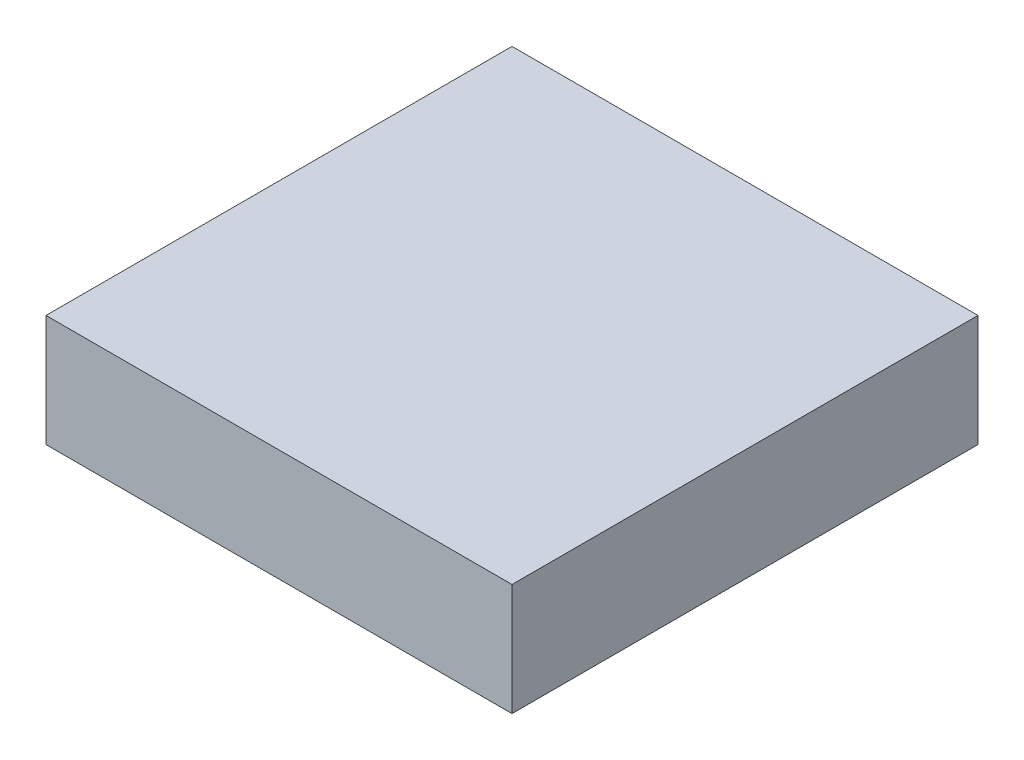
ISO-10303-21;
HEADER;
FILE_DESCRIPTION(('STEP AP214'),'2;1');
FILE_NAME('part.step','',(''),(''),'','','');
FILE_SCHEMA(('AUTOMOTIVE_DESIGN { 1 0 10303 214 1 1 1 1 }'));
ENDSEC;
DATA;
#1=APPLICATION_CONTEXT('core data for automotive mechanical design processes');
#2=APPLICATION_PROTOCOL_DEFINITION('international standard','automotive_design',2000,#1);
#3=PRODUCT_CONTEXT('',#1,'mechanical');
#4=PRODUCT('Part','Part','',(#3));
#5=PRODUCT_RELATED_PRODUCT_CATEGORY('part','',(#4));
#6=PRODUCT_DEFINITION_FORMATION('','',#4);
#7=PRODUCT_DEFINITION_CONTEXT('part definition',#1,'design');
#8=PRODUCT_DEFINITION('design','',#6,#7);
#9=PRODUCT_DEFINITION_SHAPE('','',#8);
#10=(LENGTH_UNIT() NAMED_UNIT(*) SI_UNIT(.MILLI.,.METRE.));
#11=(NAMED_UNIT(*) PLANE_ANGLE_UNIT() SI_UNIT($,.RADIAN.));
#12=(NAMED_UNIT(*) SI_UNIT($,.STERADIAN.) SOLID_ANGLE_UNIT());
#13=UNCERTAINTY_MEASURE_WITH_UNIT(LENGTH_MEASURE(1.E-05),#10,'distance_accuracy_value','');
#14=(GEOMETRIC_REPRESENTATION_CONTEXT(3) GLOBAL_UNCERTAINTY_ASSIGNED_CONTEXT((#13)) GLOBAL_UNIT_ASSIGNED_CONTEXT((#10,
#11,#12)) REPRESENTATION_CONTEXT('',''));
#15=CARTESIAN_POINT('',(0.,0.,0.));
#16=DIRECTION('',(0.,0.,1.));
#17=DIRECTION('',(1.,0.,0.));
#18=AXIS2_PLACEMENT_3D('',#15,#16,#17);
#19=CARTESIAN_POINT('',(-1175.,600.,387.5));
#20=DIRECTION('',(0.,0.,-1.));
#21=DIRECTION('',(-1.,0.,0.));
#22=AXIS2_PLACEMENT_3D('',#19,#20,#21);
#23=PLANE('',#22);
#24=DIRECTION('',(0.,1.,0.));
#25=VECTOR('',#24,1.);
#26=CARTESIAN_POINT('',(-1275.,500.,387.5));
#27=LINE('',#26,#25);
#28=CARTESIAN_POINT('',(-1275.,600.,387.5));
#29=VERTEX_POINT('',#28);
#30=CARTESIAN_POINT('',(-1275.,624.,387.5));
#31=VERTEX_POINT('',#30);
#32=EDGE_CURVE('E49',#29,#31,#27,.T.);
#33=ORIENTED_EDGE('',*,*,#32,.T.);
#34=DIRECTION('',(1.,0.,0.));
#35=VECTOR('',#34,1.);
#36=CARTESIAN_POINT('',(-1275.,624.,387.5));
#37=LINE('',#36,#35);
#38=CARTESIAN_POINT('',(-1175.,624.,387.5));
#39=VERTEX_POINT('',#38);
#40=EDGE_CURVE('E120',#31,#39,#37,.T.);
#41=ORIENTED_EDGE('',*,*,#40,.T.);
#42=DIRECTION('',(0.,1.,0.));
#43=VECTOR('',#42,1.);
#44=CARTESIAN_POINT('',(-1175.,600.,387.5));
#45=LINE('',#44,#43);
#46=CARTESIAN_POINT('',(-1175.,600.,387.5));
#47=VERTEX_POINT('',#46);
#48=EDGE_CURVE('E87',#47,#39,#45,.T.);
#49=ORIENTED_EDGE('',*,*,#48,.F.);
#50=DIRECTION('',(1.,0.,0.));
#51=VECTOR('',#50,1.);
#52=CARTESIAN_POINT('',(-1275.,600.,387.5));
#53=LINE('',#52,#51);
#54=EDGE_CURVE('E79',#47,#29,#53,.F.);
#55=ORIENTED_EDGE('',*,*,#54,.T.);
#56=EDGE_LOOP('',(#33,#41,#49,#55));
#57=FACE_BOUND('',#56,.T.);
#58=ADVANCED_FACE('F46',(#57),#23,.T.);
#59=CARTESIAN_POINT('',(-1275.,500.,0.));
#60=DIRECTION('',(1.,0.,0.));
#61=DIRECTION('',(0.,0.,-1.));
#62=AXIS2_PLACEMENT_3D('',#59,#60,#61);
#63=PLANE('',#62);
#64=DIRECTION('',(0.,1.,0.));
#65=VECTOR('',#64,1.);
#66=CARTESIAN_POINT('',(-1275.,600.,487.5));
#67=LINE('',#66,#65);
#68=CARTESIAN_POINT('',(-1275.,624.,487.5));
#69=VERTEX_POINT('',#68);
#70=CARTESIAN_POINT('',(-1275.,600.,487.5));
#71=VERTEX_POINT('',#70);
#72=EDGE_CURVE('E131',#69,#71,#67,.F.);
#73=ORIENTED_EDGE('',*,*,#72,.F.);
#74=DIRECTION('',(0.,0.,-1.));
#75=VECTOR('',#74,1.);
#76=CARTESIAN_POINT('',(-1275.,624.,487.5));
#77=LINE('',#76,#75);
#78=EDGE_CURVE('E114',#69,#31,#77,.T.);
#79=ORIENTED_EDGE('',*,*,#78,.T.);
#80=ORIENTED_EDGE('',*,*,#32,.F.);
#81=DIRECTION('',(0.,0.,1.));
#82=VECTOR('',#81,1.);
#83=CARTESIAN_POINT('',(-1275.,600.,50.));
#84=LINE('',#83,#82);
#85=EDGE_CURVE('E124',#29,#71,#84,.T.);
#86=ORIENTED_EDGE('',*,*,#85,.T.);
#87=EDGE_LOOP('',(#73,#79,#80,#86));
#88=FACE_BOUND('',#87,.T.);
#89=ADVANCED_FACE('F136',(#88),#63,.F.);
#90=CARTESIAN_POINT('',(-1275.,600.,487.5));
#91=DIRECTION('',(0.,0.,1.));
#92=DIRECTION('',(1.,0.,0.));
#93=AXIS2_PLACEMENT_3D('',#90,#91,#92);
#94=PLANE('',#93);
#95=DIRECTION('',(0.,1.,0.));
#96=VECTOR('',#95,1.);
#97=CARTESIAN_POINT('',(-1175.,600.,487.5));
#98=LINE('',#97,#96);
#99=CARTESIAN_POINT('',(-1175.,624.,487.5));
#100=VERTEX_POINT('',#99);
#101=CARTESIAN_POINT('',(-1175.,600.,487.5));
#102=VERTEX_POINT('',#101);
#103=EDGE_CURVE('E64',#100,#102,#98,.F.);
#104=ORIENTED_EDGE('',*,*,#103,.F.);
#105=DIRECTION('',(-1.,0.,0.));
#106=VECTOR('',#105,1.);
#107=CARTESIAN_POINT('',(-1175.,624.,487.5));
#108=LINE('',#107,#106);
#109=EDGE_CURVE('E105',#100,#69,#108,.T.);
#110=ORIENTED_EDGE('',*,*,#109,.T.);
#111=ORIENTED_EDGE('',*,*,#72,.T.);
#112=DIRECTION('',(1.,0.,0.));
#113=VECTOR('',#112,1.);
#114=CARTESIAN_POINT('',(-1275.,600.,487.5));
#115=LINE('',#114,#113);
#116=EDGE_CURVE('E56',#71,#102,#115,.T.);
#117=ORIENTED_EDGE('',*,*,#116,.T.);
#118=EDGE_LOOP('',(#104,#110,#111,#117));
#119=FACE_BOUND('',#118,.T.);
#120=ADVANCED_FACE('F104',(#119),#94,.T.);
#121=CARTESIAN_POINT('',(-1175.,600.,487.5));
#122=DIRECTION('',(1.,0.,0.));
#123=DIRECTION('',(0.,0.,-1.));
#124=AXIS2_PLACEMENT_3D('',#121,#122,#123);
#125=PLANE('',#124);
#126=ORIENTED_EDGE('',*,*,#48,.T.);
#127=DIRECTION('',(0.,0.,1.));
#128=VECTOR('',#127,1.);
#129=CARTESIAN_POINT('',(-1175.,624.,387.5));
#130=LINE('',#129,#128);
#131=EDGE_CURVE('E113',#39,#100,#130,.T.);
#132=ORIENTED_EDGE('',*,*,#131,.T.);
#133=ORIENTED_EDGE('',*,*,#103,.T.);
#134=DIRECTION('',(0.,0.,1.));
#135=VECTOR('',#134,1.);
#136=CARTESIAN_POINT('',(-1175.,600.,50.));
#137=LINE('',#136,#135);
#138=EDGE_CURVE('E11',#102,#47,#137,.F.);
#139=ORIENTED_EDGE('',*,*,#138,.T.);
#140=EDGE_LOOP('',(#126,#132,#133,#139));
#141=FACE_BOUND('',#140,.T.);
#142=ADVANCED_FACE('F116',(#141),#125,.T.);
#143=CARTESIAN_POINT('',(-1275.,600.,50.));
#144=DIRECTION('',(0.,1.,0.));
#145=DIRECTION('',(0.,0.,1.));
#146=AXIS2_PLACEMENT_3D('',#143,#144,#145);
#147=PLANE('',#146);
#148=ORIENTED_EDGE('',*,*,#116,.F.);
#149=ORIENTED_EDGE('',*,*,#85,.F.);
#150=ORIENTED_EDGE('',*,*,#54,.F.);
#151=ORIENTED_EDGE('',*,*,#138,.F.);
#152=EDGE_LOOP('',(#148,#149,#150,#151));
#153=FACE_BOUND('',#152,.T.);
#154=ADVANCED_FACE('F135',(#153),#147,.F.);
#155=CARTESIAN_POINT('',(0.,624.,0.));
#156=DIRECTION('',(0.,-1.,0.));
#157=DIRECTION('',(0.,0.,-1.));
#158=AXIS2_PLACEMENT_3D('',#155,#156,#157);
#159=PLANE('',#158);
#160=ORIENTED_EDGE('',*,*,#131,.F.);
#161=ORIENTED_EDGE('',*,*,#40,.F.);
#162=ORIENTED_EDGE('',*,*,#78,.F.);
#163=ORIENTED_EDGE('',*,*,#109,.F.);
#164=EDGE_LOOP('',(#160,#161,#162,#163));
#165=FACE_BOUND('',#164,.T.);
#166=ADVANCED_FACE('F111',(#165),#159,.F.);
#167=CLOSED_SHELL('',(#58,#89,#120,#142,#154,#166));
#168=MANIFOLD_SOLID_BREP('B2',#167);
#169=ADVANCED_BREP_SHAPE_REPRESENTATION('',(#18,#168),#14);
#170=SHAPE_DEFINITION_REPRESENTATION(#9,#169);
ENDSEC;
END-ISO-10303-21;
